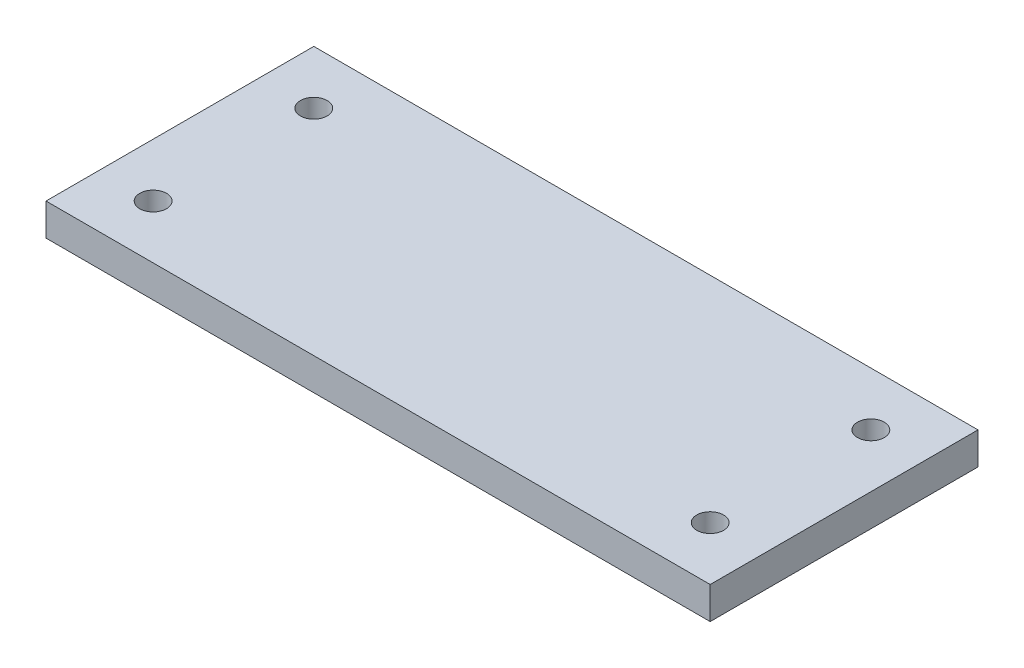
ISO-10303-21;
HEADER;
FILE_DESCRIPTION(('STEP AP214'),'2;1');
FILE_NAME('part.step','',(''),(''),'','','');
FILE_SCHEMA(('AUTOMOTIVE_DESIGN { 1 0 10303 214 1 1 1 1 }'));
ENDSEC;
DATA;
#1=APPLICATION_CONTEXT('core data for automotive mechanical design processes');
#2=APPLICATION_PROTOCOL_DEFINITION('international standard','automotive_design',2000,#1);
#3=PRODUCT_CONTEXT('',#1,'mechanical');
#4=PRODUCT('Part','Part','',(#3));
#5=PRODUCT_RELATED_PRODUCT_CATEGORY('part','',(#4));
#6=PRODUCT_DEFINITION_FORMATION('','',#4);
#7=PRODUCT_DEFINITION_CONTEXT('part definition',#1,'design');
#8=PRODUCT_DEFINITION('design','',#6,#7);
#9=PRODUCT_DEFINITION_SHAPE('','',#8);
#10=(LENGTH_UNIT() NAMED_UNIT(*) SI_UNIT(.MILLI.,.METRE.));
#11=(NAMED_UNIT(*) PLANE_ANGLE_UNIT() SI_UNIT($,.RADIAN.));
#12=(NAMED_UNIT(*) SI_UNIT($,.STERADIAN.) SOLID_ANGLE_UNIT());
#13=UNCERTAINTY_MEASURE_WITH_UNIT(LENGTH_MEASURE(1.E-05),#10,'distance_accuracy_value','');
#14=(GEOMETRIC_REPRESENTATION_CONTEXT(3) GLOBAL_UNCERTAINTY_ASSIGNED_CONTEXT((#13)) GLOBAL_UNIT_ASSIGNED_CONTEXT((#10,
#11,#12)) REPRESENTATION_CONTEXT('',''));
#15=CARTESIAN_POINT('',(0.,0.,0.));
#16=DIRECTION('',(0.,0.,1.));
#17=DIRECTION('',(1.,0.,0.));
#18=AXIS2_PLACEMENT_3D('',#15,#16,#17);
#19=CARTESIAN_POINT('',(0.,3.,0.));
#20=DIRECTION('',(1.,0.,0.));
#21=DIRECTION('',(0.,0.,-1.));
#22=AXIS2_PLACEMENT_3D('',#19,#20,#21);
#23=PLANE('',#22);
#24=DIRECTION('',(0.,0.,1.));
#25=VECTOR('',#24,1.);
#26=CARTESIAN_POINT('',(0.,0.,0.));
#27=LINE('',#26,#25);
#28=CARTESIAN_POINT('',(0.,0.,-25.));
#29=VERTEX_POINT('',#28);
#30=CARTESIAN_POINT('',(0.,0.,0.));
#31=VERTEX_POINT('',#30);
#32=EDGE_CURVE('E110',#29,#31,#27,.T.);
#33=ORIENTED_EDGE('',*,*,#32,.T.);
#34=DIRECTION('',(0.,-1.,0.));
#35=VECTOR('',#34,1.);
#36=CARTESIAN_POINT('',(0.,3.,0.));
#37=LINE('',#36,#35);
#38=CARTESIAN_POINT('',(0.,3.,0.));
#39=VERTEX_POINT('',#38);
#40=EDGE_CURVE('E11',#39,#31,#37,.T.);
#41=ORIENTED_EDGE('',*,*,#40,.F.);
#42=DIRECTION('',(0.,0.,1.));
#43=VECTOR('',#42,1.);
#44=CARTESIAN_POINT('',(0.,3.,0.));
#45=LINE('',#44,#43);
#46=CARTESIAN_POINT('',(0.,3.,-25.));
#47=VERTEX_POINT('',#46);
#48=EDGE_CURVE('E97',#47,#39,#45,.T.);
#49=ORIENTED_EDGE('',*,*,#48,.F.);
#50=DIRECTION('',(0.,-1.,0.));
#51=VECTOR('',#50,1.);
#52=CARTESIAN_POINT('',(0.,3.,-25.));
#53=LINE('',#52,#51);
#54=EDGE_CURVE('E106',#47,#29,#53,.T.);
#55=ORIENTED_EDGE('',*,*,#54,.T.);
#56=EDGE_LOOP('',(#33,#41,#49,#55));
#57=FACE_BOUND('',#56,.T.);
#58=ADVANCED_FACE('F44',(#57),#23,.F.);
#59=CARTESIAN_POINT('',(0.,3.,0.));
#60=DIRECTION('',(0.,0.,-1.));
#61=DIRECTION('',(-1.,0.,0.));
#62=AXIS2_PLACEMENT_3D('',#59,#60,#61);
#63=PLANE('',#62);
#64=DIRECTION('',(1.,0.,0.));
#65=VECTOR('',#64,1.);
#66=CARTESIAN_POINT('',(0.,0.,0.));
#67=LINE('',#66,#65);
#68=CARTESIAN_POINT('',(62.,0.,0.));
#69=VERTEX_POINT('',#68);
#70=EDGE_CURVE('E101',#31,#69,#67,.T.);
#71=ORIENTED_EDGE('',*,*,#70,.T.);
#72=DIRECTION('',(0.,-1.,0.));
#73=VECTOR('',#72,1.);
#74=CARTESIAN_POINT('',(62.,3.,0.));
#75=LINE('',#74,#73);
#76=CARTESIAN_POINT('',(62.,3.,0.));
#77=VERTEX_POINT('',#76);
#78=EDGE_CURVE('E53',#77,#69,#75,.T.);
#79=ORIENTED_EDGE('',*,*,#78,.F.);
#80=DIRECTION('',(1.,0.,0.));
#81=VECTOR('',#80,1.);
#82=CARTESIAN_POINT('',(0.,3.,0.));
#83=LINE('',#82,#81);
#84=EDGE_CURVE('E92',#39,#77,#83,.T.);
#85=ORIENTED_EDGE('',*,*,#84,.F.);
#86=ORIENTED_EDGE('',*,*,#40,.T.);
#87=EDGE_LOOP('',(#71,#79,#85,#86));
#88=FACE_BOUND('',#87,.T.);
#89=ADVANCED_FACE('F100',(#88),#63,.F.);
#90=CARTESIAN_POINT('',(62.,3.,0.));
#91=DIRECTION('',(-1.,0.,0.));
#92=DIRECTION('',(0.,0.,1.));
#93=AXIS2_PLACEMENT_3D('',#90,#91,#92);
#94=PLANE('',#93);
#95=DIRECTION('',(0.,0.,-1.));
#96=VECTOR('',#95,1.);
#97=CARTESIAN_POINT('',(62.,0.,0.));
#98=LINE('',#97,#96);
#99=CARTESIAN_POINT('',(62.,0.,-25.));
#100=VERTEX_POINT('',#99);
#101=EDGE_CURVE('E79',#69,#100,#98,.T.);
#102=ORIENTED_EDGE('',*,*,#101,.T.);
#103=DIRECTION('',(0.,-1.,0.));
#104=VECTOR('',#103,1.);
#105=CARTESIAN_POINT('',(62.,3.,-25.));
#106=LINE('',#105,#104);
#107=CARTESIAN_POINT('',(62.,3.,-25.));
#108=VERTEX_POINT('',#107);
#109=EDGE_CURVE('E102',#108,#100,#106,.T.);
#110=ORIENTED_EDGE('',*,*,#109,.F.);
#111=DIRECTION('',(0.,0.,-1.));
#112=VECTOR('',#111,1.);
#113=CARTESIAN_POINT('',(62.,3.,0.));
#114=LINE('',#113,#112);
#115=EDGE_CURVE('E95',#77,#108,#114,.T.);
#116=ORIENTED_EDGE('',*,*,#115,.F.);
#117=ORIENTED_EDGE('',*,*,#78,.T.);
#118=EDGE_LOOP('',(#102,#110,#116,#117));
#119=FACE_BOUND('',#118,.T.);
#120=ADVANCED_FACE('F104',(#119),#94,.F.);
#121=CARTESIAN_POINT('',(0.,3.,-25.));
#122=DIRECTION('',(0.,0.,1.));
#123=DIRECTION('',(1.,0.,0.));
#124=AXIS2_PLACEMENT_3D('',#121,#122,#123);
#125=PLANE('',#124);
#126=DIRECTION('',(-1.,0.,0.));
#127=VECTOR('',#126,1.);
#128=CARTESIAN_POINT('',(0.,0.,-25.));
#129=LINE('',#128,#127);
#130=EDGE_CURVE('E85',#100,#29,#129,.T.);
#131=ORIENTED_EDGE('',*,*,#130,.T.);
#132=ORIENTED_EDGE('',*,*,#54,.F.);
#133=DIRECTION('',(-1.,0.,0.));
#134=VECTOR('',#133,1.);
#135=CARTESIAN_POINT('',(0.,3.,-25.));
#136=LINE('',#135,#134);
#137=EDGE_CURVE('E62',#108,#47,#136,.T.);
#138=ORIENTED_EDGE('',*,*,#137,.F.);
#139=ORIENTED_EDGE('',*,*,#109,.T.);
#140=EDGE_LOOP('',(#131,#132,#138,#139));
#141=FACE_BOUND('',#140,.T.);
#142=ADVANCED_FACE('F146',(#141),#125,.F.);
#143=CARTESIAN_POINT('',(0.,3.,0.));
#144=DIRECTION('',(0.,-1.,0.));
#145=DIRECTION('',(0.,0.,-1.));
#146=AXIS2_PLACEMENT_3D('',#143,#144,#145);
#147=PLANE('',#146);
#148=CARTESIAN_POINT('',(5.,3.,-20.));
#149=DIRECTION('',(0.,1.,0.));
#150=DIRECTION('',(0.,0.,1.));
#151=AXIS2_PLACEMENT_3D('',#148,#149,#150);
#152=CIRCLE('',#151,1.25);
#153=CARTESIAN_POINT('',(5.,3.,-18.75));
#154=VERTEX_POINT('',#153);
#155=EDGE_CURVE('E229',#154,#154,#152,.T.);
#156=ORIENTED_EDGE('',*,*,#155,.F.);
#157=EDGE_LOOP('',(#156));
#158=FACE_BOUND('',#157,.T.);
#159=CARTESIAN_POINT('',(57.,3.,-20.));
#160=DIRECTION('',(0.,1.,0.));
#161=DIRECTION('',(0.,0.,1.));
#162=AXIS2_PLACEMENT_3D('',#159,#160,#161);
#163=CIRCLE('',#162,1.25);
#164=CARTESIAN_POINT('',(57.,3.,-18.75));
#165=VERTEX_POINT('',#164);
#166=EDGE_CURVE('E226',#165,#165,#163,.T.);
#167=ORIENTED_EDGE('',*,*,#166,.F.);
#168=EDGE_LOOP('',(#167));
#169=FACE_BOUND('',#168,.T.);
#170=CARTESIAN_POINT('',(57.,3.,-5.));
#171=DIRECTION('',(0.,1.,0.));
#172=DIRECTION('',(0.,0.,1.));
#173=AXIS2_PLACEMENT_3D('',#170,#171,#172);
#174=CIRCLE('',#173,1.25);
#175=CARTESIAN_POINT('',(57.,3.,-3.75));
#176=VERTEX_POINT('',#175);
#177=EDGE_CURVE('E228',#176,#176,#174,.T.);
#178=ORIENTED_EDGE('',*,*,#177,.F.);
#179=EDGE_LOOP('',(#178));
#180=FACE_BOUND('',#179,.T.);
#181=CARTESIAN_POINT('',(5.,3.,-5.));
#182=DIRECTION('',(0.,1.,0.));
#183=DIRECTION('',(0.,0.,1.));
#184=AXIS2_PLACEMENT_3D('',#181,#182,#183);
#185=CIRCLE('',#184,1.25);
#186=CARTESIAN_POINT('',(5.,3.,-3.75));
#187=VERTEX_POINT('',#186);
#188=EDGE_CURVE('E122',#187,#187,#185,.T.);
#189=ORIENTED_EDGE('',*,*,#188,.F.);
#190=EDGE_LOOP('',(#189));
#191=FACE_BOUND('',#190,.T.);
#192=ORIENTED_EDGE('',*,*,#48,.T.);
#193=ORIENTED_EDGE('',*,*,#84,.T.);
#194=ORIENTED_EDGE('',*,*,#115,.T.);
#195=ORIENTED_EDGE('',*,*,#137,.T.);
#196=EDGE_LOOP('',(#192,#193,#194,#195));
#197=FACE_BOUND('',#196,.T.);
#198=ADVANCED_FACE('F93',(#158,#169,#180,#191,#197),#147,.F.);
#199=CARTESIAN_POINT('',(0.,0.,0.));
#200=DIRECTION('',(0.,-1.,0.));
#201=DIRECTION('',(0.,0.,-1.));
#202=AXIS2_PLACEMENT_3D('',#199,#200,#201);
#203=PLANE('',#202);
#204=CARTESIAN_POINT('',(5.,0.,-20.));
#205=DIRECTION('',(0.,-1.,0.));
#206=DIRECTION('',(0.,0.,-1.));
#207=AXIS2_PLACEMENT_3D('',#204,#205,#206);
#208=CIRCLE('',#207,1.25);
#209=CARTESIAN_POINT('',(5.,0.,-21.25));
#210=VERTEX_POINT('',#209);
#211=EDGE_CURVE('E47',#210,#210,#208,.T.);
#212=ORIENTED_EDGE('',*,*,#211,.F.);
#213=EDGE_LOOP('',(#212));
#214=FACE_BOUND('',#213,.T.);
#215=CARTESIAN_POINT('',(57.,0.,-20.));
#216=DIRECTION('',(0.,-1.,0.));
#217=DIRECTION('',(0.,0.,-1.));
#218=AXIS2_PLACEMENT_3D('',#215,#216,#217);
#219=CIRCLE('',#218,1.25);
#220=CARTESIAN_POINT('',(57.,0.,-21.25));
#221=VERTEX_POINT('',#220);
#222=EDGE_CURVE('E124',#221,#221,#219,.T.);
#223=ORIENTED_EDGE('',*,*,#222,.F.);
#224=EDGE_LOOP('',(#223));
#225=FACE_BOUND('',#224,.T.);
#226=CARTESIAN_POINT('',(57.,0.,-5.));
#227=DIRECTION('',(0.,-1.,0.));
#228=DIRECTION('',(0.,0.,-1.));
#229=AXIS2_PLACEMENT_3D('',#226,#227,#228);
#230=CIRCLE('',#229,1.25);
#231=CARTESIAN_POINT('',(57.,0.,-6.25));
#232=VERTEX_POINT('',#231);
#233=EDGE_CURVE('E121',#232,#232,#230,.T.);
#234=ORIENTED_EDGE('',*,*,#233,.F.);
#235=EDGE_LOOP('',(#234));
#236=FACE_BOUND('',#235,.T.);
#237=CARTESIAN_POINT('',(5.,0.,-5.));
#238=DIRECTION('',(0.,-1.,0.));
#239=DIRECTION('',(0.,0.,-1.));
#240=AXIS2_PLACEMENT_3D('',#237,#238,#239);
#241=CIRCLE('',#240,1.25);
#242=CARTESIAN_POINT('',(5.,0.,-6.25));
#243=VERTEX_POINT('',#242);
#244=EDGE_CURVE('E118',#243,#243,#241,.T.);
#245=ORIENTED_EDGE('',*,*,#244,.F.);
#246=EDGE_LOOP('',(#245));
#247=FACE_BOUND('',#246,.T.);
#248=ORIENTED_EDGE('',*,*,#32,.F.);
#249=ORIENTED_EDGE('',*,*,#130,.F.);
#250=ORIENTED_EDGE('',*,*,#101,.F.);
#251=ORIENTED_EDGE('',*,*,#70,.F.);
#252=EDGE_LOOP('',(#248,#249,#250,#251));
#253=FACE_BOUND('',#252,.T.);
#254=ADVANCED_FACE('F134',(#214,#225,#236,#247,#253),#203,.T.);
#255=CARTESIAN_POINT('',(5.,-2.,-5.));
#256=DIRECTION('',(0.,1.,0.));
#257=DIRECTION('',(0.,0.,1.));
#258=AXIS2_PLACEMENT_3D('',#255,#256,#257);
#259=CYLINDRICAL_SURFACE('',#258,1.25);
#260=ORIENTED_EDGE('',*,*,#244,.T.);
#261=EDGE_LOOP('',(#260));
#262=FACE_BOUND('',#261,.T.);
#263=ORIENTED_EDGE('',*,*,#188,.T.);
#264=EDGE_LOOP('',(#263));
#265=FACE_BOUND('',#264,.T.);
#266=ADVANCED_FACE('F137',(#262,#265),#259,.F.);
#267=CARTESIAN_POINT('',(57.,-2.,-5.));
#268=DIRECTION('',(0.,1.,0.));
#269=DIRECTION('',(0.,0.,1.));
#270=AXIS2_PLACEMENT_3D('',#267,#268,#269);
#271=CYLINDRICAL_SURFACE('',#270,1.25);
#272=ORIENTED_EDGE('',*,*,#233,.T.);
#273=EDGE_LOOP('',(#272));
#274=FACE_BOUND('',#273,.T.);
#275=ORIENTED_EDGE('',*,*,#177,.T.);
#276=EDGE_LOOP('',(#275));
#277=FACE_BOUND('',#276,.T.);
#278=ADVANCED_FACE('F193',(#274,#277),#271,.F.);
#279=CARTESIAN_POINT('',(57.,-2.,-20.));
#280=DIRECTION('',(0.,1.,0.));
#281=DIRECTION('',(0.,0.,1.));
#282=AXIS2_PLACEMENT_3D('',#279,#280,#281);
#283=CYLINDRICAL_SURFACE('',#282,1.25);
#284=ORIENTED_EDGE('',*,*,#222,.T.);
#285=EDGE_LOOP('',(#284));
#286=FACE_BOUND('',#285,.T.);
#287=ORIENTED_EDGE('',*,*,#166,.T.);
#288=EDGE_LOOP('',(#287));
#289=FACE_BOUND('',#288,.T.);
#290=ADVANCED_FACE('F203',(#286,#289),#283,.F.);
#291=CARTESIAN_POINT('',(5.,-2.,-20.));
#292=DIRECTION('',(0.,1.,0.));
#293=DIRECTION('',(0.,0.,1.));
#294=AXIS2_PLACEMENT_3D('',#291,#292,#293);
#295=CYLINDRICAL_SURFACE('',#294,1.25);
#296=ORIENTED_EDGE('',*,*,#211,.T.);
#297=EDGE_LOOP('',(#296));
#298=FACE_BOUND('',#297,.T.);
#299=ORIENTED_EDGE('',*,*,#155,.T.);
#300=EDGE_LOOP('',(#299));
#301=FACE_BOUND('',#300,.T.);
#302=ADVANCED_FACE('F131',(#298,#301),#295,.F.);
#303=CLOSED_SHELL('',(#58,#89,#120,#142,#198,#254,#266,#278,#290,#302));
#304=MANIFOLD_SOLID_BREP('B2',#303);
#305=ADVANCED_BREP_SHAPE_REPRESENTATION('',(#18,#304),#14);
#306=SHAPE_DEFINITION_REPRESENTATION(#9,#305);
ENDSEC;
END-ISO-10303-21;
